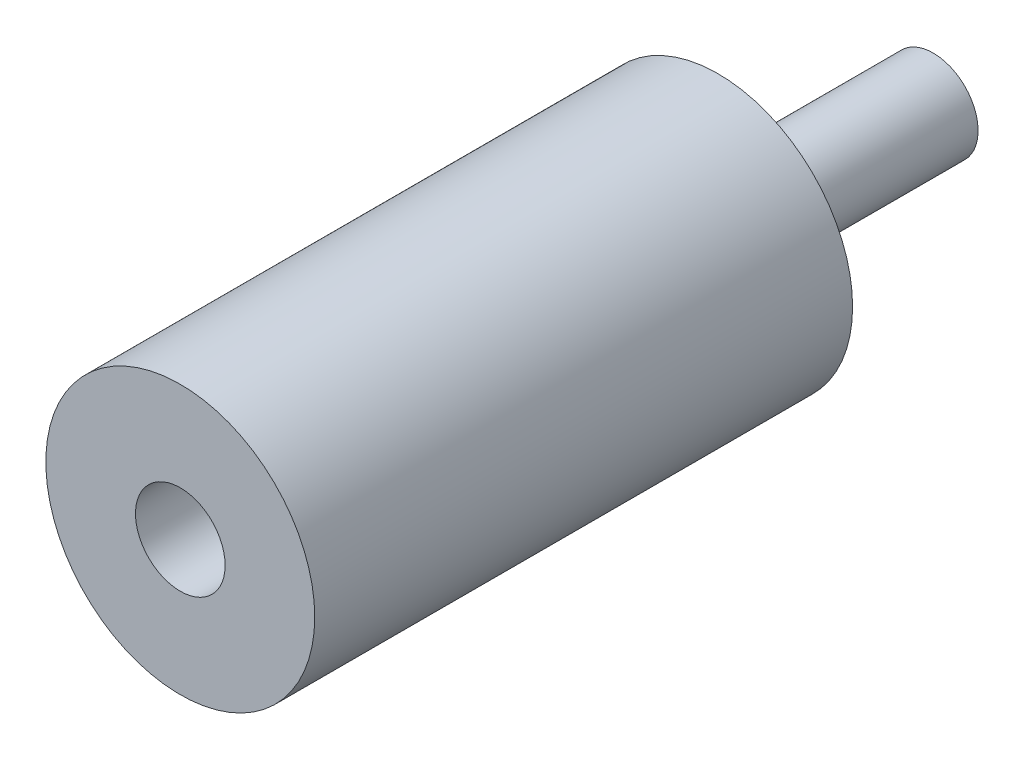
ISO-10303-21;
HEADER;
FILE_DESCRIPTION(('STEP AP214'),'2;1');
FILE_NAME('part.step','',(''),(''),'','','');
FILE_SCHEMA(('AUTOMOTIVE_DESIGN { 1 0 10303 214 1 1 1 1 }'));
ENDSEC;
DATA;
#1=APPLICATION_CONTEXT('core data for automotive mechanical design processes');
#2=APPLICATION_PROTOCOL_DEFINITION('international standard','automotive_design',2000,#1);
#3=PRODUCT_CONTEXT('',#1,'mechanical');
#4=PRODUCT('Part','Part','',(#3));
#5=PRODUCT_RELATED_PRODUCT_CATEGORY('part','',(#4));
#6=PRODUCT_DEFINITION_FORMATION('','',#4);
#7=PRODUCT_DEFINITION_CONTEXT('part definition',#1,'design');
#8=PRODUCT_DEFINITION('design','',#6,#7);
#9=PRODUCT_DEFINITION_SHAPE('','',#8);
#10=(LENGTH_UNIT() NAMED_UNIT(*) SI_UNIT(.MILLI.,.METRE.));
#11=(NAMED_UNIT(*) PLANE_ANGLE_UNIT() SI_UNIT($,.RADIAN.));
#12=(NAMED_UNIT(*) SI_UNIT($,.STERADIAN.) SOLID_ANGLE_UNIT());
#13=UNCERTAINTY_MEASURE_WITH_UNIT(LENGTH_MEASURE(1.E-05),#10,'distance_accuracy_value','');
#14=(GEOMETRIC_REPRESENTATION_CONTEXT(3) GLOBAL_UNCERTAINTY_ASSIGNED_CONTEXT((#13)) GLOBAL_UNIT_ASSIGNED_CONTEXT((#10,
#11,#12)) REPRESENTATION_CONTEXT('',''));
#15=CARTESIAN_POINT('',(0.,0.,0.));
#16=DIRECTION('',(0.,0.,1.));
#17=DIRECTION('',(1.,0.,0.));
#18=AXIS2_PLACEMENT_3D('',#15,#16,#17);
#19=CARTESIAN_POINT('',(0.,0.,30.));
#20=DIRECTION('',(0.,0.,-1.));
#21=DIRECTION('',(-1.,0.,0.));
#22=AXIS2_PLACEMENT_3D('',#19,#20,#21);
#23=CYLINDRICAL_SURFACE('',#22,7.5);
#24=CARTESIAN_POINT('',(0.,0.,30.));
#25=DIRECTION('',(0.,0.,1.));
#26=DIRECTION('',(1.,0.,0.));
#27=AXIS2_PLACEMENT_3D('',#24,#25,#26);
#28=CIRCLE('',#27,7.5);
#29=CARTESIAN_POINT('',(7.5,0.,30.));
#30=VERTEX_POINT('',#29);
#31=EDGE_CURVE('E40',#30,#30,#28,.T.);
#32=ORIENTED_EDGE('',*,*,#31,.F.);
#33=EDGE_LOOP('',(#32));
#34=FACE_BOUND('',#33,.T.);
#35=CARTESIAN_POINT('',(0.,0.,0.));
#36=DIRECTION('',(0.,0.,1.));
#37=DIRECTION('',(1.,0.,0.));
#38=AXIS2_PLACEMENT_3D('',#35,#36,#37);
#39=CIRCLE('',#38,7.5);
#40=CARTESIAN_POINT('',(7.5,0.,0.));
#41=VERTEX_POINT('',#40);
#42=EDGE_CURVE('E36',#41,#41,#39,.T.);
#43=ORIENTED_EDGE('',*,*,#42,.T.);
#44=EDGE_LOOP('',(#43));
#45=FACE_BOUND('',#44,.T.);
#46=ADVANCED_FACE('F33',(#34,#45),#23,.T.);
#47=CARTESIAN_POINT('',(0.,0.,30.));
#48=DIRECTION('',(0.,0.,1.));
#49=DIRECTION('',(1.,0.,0.));
#50=AXIS2_PLACEMENT_3D('',#47,#48,#49);
#51=PLANE('',#50);
#52=CARTESIAN_POINT('',(0.,0.,30.));
#53=DIRECTION('',(0.,0.,1.));
#54=DIRECTION('',(1.,0.,0.));
#55=AXIS2_PLACEMENT_3D('',#52,#53,#54);
#56=CIRCLE('',#55,2.5);
#57=CARTESIAN_POINT('',(2.5,0.,30.));
#58=VERTEX_POINT('',#57);
#59=EDGE_CURVE('E50',#58,#58,#56,.T.);
#60=ORIENTED_EDGE('',*,*,#59,.F.);
#61=EDGE_LOOP('',(#60));
#62=FACE_BOUND('',#61,.T.);
#63=ORIENTED_EDGE('',*,*,#31,.T.);
#64=EDGE_LOOP('',(#63));
#65=FACE_BOUND('',#64,.T.);
#66=ADVANCED_FACE('F65',(#62,#65),#51,.T.);
#67=CARTESIAN_POINT('',(0.,0.,0.));
#68=DIRECTION('',(0.,0.,1.));
#69=DIRECTION('',(1.,0.,0.));
#70=AXIS2_PLACEMENT_3D('',#67,#68,#69);
#71=PLANE('',#70);
#72=CARTESIAN_POINT('',(0.,0.,0.));
#73=DIRECTION('',(0.,0.,-1.));
#74=DIRECTION('',(-1.,0.,0.));
#75=AXIS2_PLACEMENT_3D('',#72,#73,#74);
#76=CIRCLE('',#75,2.5);
#77=CARTESIAN_POINT('',(-2.5,0.,0.));
#78=VERTEX_POINT('',#77);
#79=EDGE_CURVE('E10',#78,#78,#76,.T.);
#80=ORIENTED_EDGE('',*,*,#79,.F.);
#81=EDGE_LOOP('',(#80));
#82=FACE_BOUND('',#81,.T.);
#83=ORIENTED_EDGE('',*,*,#42,.F.);
#84=EDGE_LOOP('',(#83));
#85=FACE_BOUND('',#84,.T.);
#86=ADVANCED_FACE('F68',(#82,#85),#71,.F.);
#87=CARTESIAN_POINT('',(0.,0.,-12.));
#88=DIRECTION('',(0.,0.,1.));
#89=DIRECTION('',(1.,0.,0.));
#90=AXIS2_PLACEMENT_3D('',#87,#88,#89);
#91=CYLINDRICAL_SURFACE('',#90,2.5);
#92=CARTESIAN_POINT('',(0.,0.,-12.));
#93=DIRECTION('',(0.,0.,-1.));
#94=DIRECTION('',(-1.,0.,0.));
#95=AXIS2_PLACEMENT_3D('',#92,#93,#94);
#96=CIRCLE('',#95,2.5);
#97=CARTESIAN_POINT('',(-2.5,0.,-12.));
#98=VERTEX_POINT('',#97);
#99=EDGE_CURVE('E46',#98,#98,#96,.T.);
#100=ORIENTED_EDGE('',*,*,#99,.F.);
#101=EDGE_LOOP('',(#100));
#102=FACE_BOUND('',#101,.T.);
#103=ORIENTED_EDGE('',*,*,#79,.T.);
#104=EDGE_LOOP('',(#103));
#105=FACE_BOUND('',#104,.T.);
#106=ADVANCED_FACE('F78',(#102,#105),#91,.T.);
#107=CARTESIAN_POINT('',(0.,0.,-12.));
#108=DIRECTION('',(0.,0.,-1.));
#109=DIRECTION('',(-1.,0.,0.));
#110=AXIS2_PLACEMENT_3D('',#107,#108,#109);
#111=PLANE('',#110);
#112=ORIENTED_EDGE('',*,*,#99,.T.);
#113=EDGE_LOOP('',(#112));
#114=FACE_BOUND('',#113,.T.);
#115=ADVANCED_FACE('F61',(#114),#111,.T.);
#116=CARTESIAN_POINT('',(0.,0.,25.));
#117=DIRECTION('',(0.,0.,1.));
#118=DIRECTION('',(1.,0.,0.));
#119=AXIS2_PLACEMENT_3D('',#116,#117,#118);
#120=CYLINDRICAL_SURFACE('',#119,2.5);
#121=CARTESIAN_POINT('',(0.,0.,25.));
#122=DIRECTION('',(0.,0.,1.));
#123=DIRECTION('',(1.,0.,0.));
#124=AXIS2_PLACEMENT_3D('',#121,#122,#123);
#125=CIRCLE('',#124,2.5);
#126=CARTESIAN_POINT('',(2.5,0.,25.));
#127=VERTEX_POINT('',#126);
#128=EDGE_CURVE('E49',#127,#127,#125,.T.);
#129=ORIENTED_EDGE('',*,*,#128,.F.);
#130=EDGE_LOOP('',(#129));
#131=FACE_BOUND('',#130,.T.);
#132=ORIENTED_EDGE('',*,*,#59,.T.);
#133=EDGE_LOOP('',(#132));
#134=FACE_BOUND('',#133,.T.);
#135=ADVANCED_FACE('F58',(#131,#134),#120,.F.);
#136=CARTESIAN_POINT('',(0.,0.,25.));
#137=DIRECTION('',(0.,0.,1.));
#138=DIRECTION('',(1.,0.,0.));
#139=AXIS2_PLACEMENT_3D('',#136,#137,#138);
#140=PLANE('',#139);
#141=ORIENTED_EDGE('',*,*,#128,.T.);
#142=EDGE_LOOP('',(#141));
#143=FACE_BOUND('',#142,.T.);
#144=ADVANCED_FACE('F56',(#143),#140,.T.);
#145=CLOSED_SHELL('',(#46,#66,#86,#106,#115,#135,#144));
#146=MANIFOLD_SOLID_BREP('B2',#145);
#147=ADVANCED_BREP_SHAPE_REPRESENTATION('',(#18,#146),#14);
#148=SHAPE_DEFINITION_REPRESENTATION(#9,#147);
ENDSEC;
END-ISO-10303-21;
